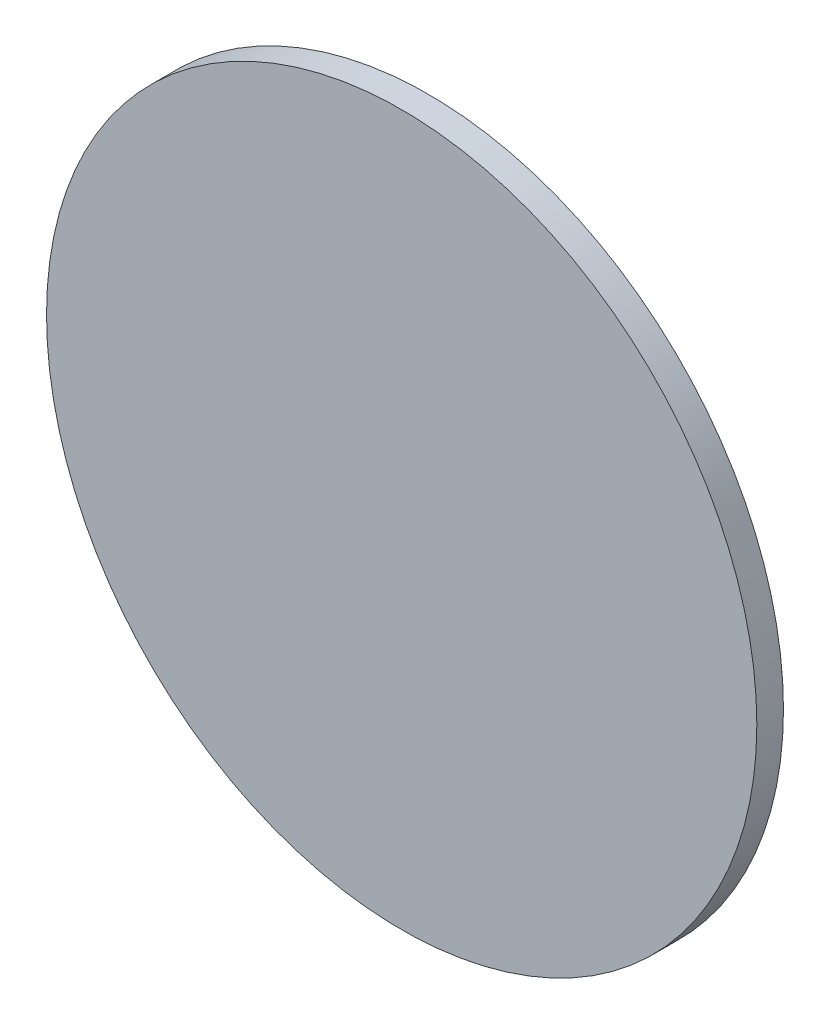
ISO-10303-21;
HEADER;
FILE_DESCRIPTION(('STEP AP214'),'2;1');
FILE_NAME('part.step','',(''),(''),'','','');
FILE_SCHEMA(('AUTOMOTIVE_DESIGN { 1 0 10303 214 1 1 1 1 }'));
ENDSEC;
DATA;
#1=APPLICATION_CONTEXT('core data for automotive mechanical design processes');
#2=APPLICATION_PROTOCOL_DEFINITION('international standard','automotive_design',2000,#1);
#3=PRODUCT_CONTEXT('',#1,'mechanical');
#4=PRODUCT('Part','Part','',(#3));
#5=PRODUCT_RELATED_PRODUCT_CATEGORY('part','',(#4));
#6=PRODUCT_DEFINITION_FORMATION('','',#4);
#7=PRODUCT_DEFINITION_CONTEXT('part definition',#1,'design');
#8=PRODUCT_DEFINITION('design','',#6,#7);
#9=PRODUCT_DEFINITION_SHAPE('','',#8);
#10=(LENGTH_UNIT() NAMED_UNIT(*) SI_UNIT(.MILLI.,.METRE.));
#11=(NAMED_UNIT(*) PLANE_ANGLE_UNIT() SI_UNIT($,.RADIAN.));
#12=(NAMED_UNIT(*) SI_UNIT($,.STERADIAN.) SOLID_ANGLE_UNIT());
#13=UNCERTAINTY_MEASURE_WITH_UNIT(LENGTH_MEASURE(1.E-05),#10,'distance_accuracy_value','');
#14=(GEOMETRIC_REPRESENTATION_CONTEXT(3) GLOBAL_UNCERTAINTY_ASSIGNED_CONTEXT((#13)) GLOBAL_UNIT_ASSIGNED_CONTEXT((#10,
#11,#12)) REPRESENTATION_CONTEXT('',''));
#15=CARTESIAN_POINT('',(0.,0.,0.));
#16=DIRECTION('',(0.,0.,1.));
#17=DIRECTION('',(1.,0.,0.));
#18=AXIS2_PLACEMENT_3D('',#15,#16,#17);
#19=CARTESIAN_POINT('',(0.,0.,3.81));
#20=DIRECTION('',(0.,0.,-1.));
#21=DIRECTION('',(-1.,0.,0.));
#22=AXIS2_PLACEMENT_3D('',#19,#20,#21);
#23=CYLINDRICAL_SURFACE('',#22,50.8);
#24=CARTESIAN_POINT('',(0.,0.,3.81));
#25=DIRECTION('',(0.,0.,1.));
#26=DIRECTION('',(1.,0.,0.));
#27=AXIS2_PLACEMENT_3D('',#24,#25,#26);
#28=CIRCLE('',#27,50.8);
#29=CARTESIAN_POINT('',(-50.8,0.,3.81));
#30=VERTEX_POINT('',#29);
#31=EDGE_CURVE('E10',#30,#30,#28,.T.);
#32=CARTESIAN_POINT('',(0.,0.,0.));
#33=DIRECTION('',(0.,0.,1.));
#34=DIRECTION('',(1.,0.,0.));
#35=AXIS2_PLACEMENT_3D('',#32,#33,#34);
#36=CIRCLE('',#35,50.8);
#37=CARTESIAN_POINT('',(-50.8,0.,0.));
#38=VERTEX_POINT('',#37);
#39=EDGE_CURVE('E36',#38,#38,#36,.T.);
#40=CARTESIAN_POINT('',(-50.8,0.,3.81));
#41=CARTESIAN_POINT('',(-50.8,0.,3.7703125));
#42=CARTESIAN_POINT('',(-50.8,0.,3.730625));
#43=CARTESIAN_POINT('',(-50.8,0.,3.65125));
#44=CARTESIAN_POINT('',(-50.8,0.,3.6115625));
#45=CARTESIAN_POINT('',(-50.8,0.,3.5321875));
#46=CARTESIAN_POINT('',(-50.8,0.,3.4925));
#47=CARTESIAN_POINT('',(-50.8,0.,3.413125));
#48=CARTESIAN_POINT('',(-50.8,0.,3.3734375));
#49=CARTESIAN_POINT('',(-50.8,0.,3.2940625));
#50=CARTESIAN_POINT('',(-50.8,0.,3.254375));
#51=CARTESIAN_POINT('',(-50.8,0.,3.175));
#52=CARTESIAN_POINT('',(-50.8,0.,3.1353125));
#53=CARTESIAN_POINT('',(-50.8,0.,3.0559375));
#54=CARTESIAN_POINT('',(-50.8,0.,3.01625));
#55=CARTESIAN_POINT('',(-50.8,0.,2.936875));
#56=CARTESIAN_POINT('',(-50.8,0.,2.8971875));
#57=CARTESIAN_POINT('',(-50.8,0.,2.8178125));
#58=CARTESIAN_POINT('',(-50.8,0.,2.778125));
#59=CARTESIAN_POINT('',(-50.8,0.,2.69875));
#60=CARTESIAN_POINT('',(-50.8,0.,2.6590625));
#61=CARTESIAN_POINT('',(-50.8,0.,2.5796875));
#62=CARTESIAN_POINT('',(-50.8,0.,2.54));
#63=CARTESIAN_POINT('',(-50.8,0.,2.460625));
#64=CARTESIAN_POINT('',(-50.8,0.,2.4209375));
#65=CARTESIAN_POINT('',(-50.8,0.,2.3415625));
#66=CARTESIAN_POINT('',(-50.8,0.,2.301875));
#67=CARTESIAN_POINT('',(-50.8,0.,2.2225));
#68=CARTESIAN_POINT('',(-50.8,0.,2.1828125));
#69=CARTESIAN_POINT('',(-50.8,0.,2.1034375));
#70=CARTESIAN_POINT('',(-50.8,0.,2.06375));
#71=CARTESIAN_POINT('',(-50.8,0.,1.984375));
#72=CARTESIAN_POINT('',(-50.8,0.,1.9446875));
#73=CARTESIAN_POINT('',(-50.8,0.,1.8653125));
#74=CARTESIAN_POINT('',(-50.8,0.,1.825625));
#75=CARTESIAN_POINT('',(-50.8,0.,1.74625));
#76=CARTESIAN_POINT('',(-50.8,0.,1.7065625));
#77=CARTESIAN_POINT('',(-50.8,0.,1.6271875));
#78=CARTESIAN_POINT('',(-50.8,0.,1.5875));
#79=CARTESIAN_POINT('',(-50.8,0.,1.508125));
#80=CARTESIAN_POINT('',(-50.8,0.,1.4684375));
#81=CARTESIAN_POINT('',(-50.8,0.,1.3890625));
#82=CARTESIAN_POINT('',(-50.8,0.,1.349375));
#83=CARTESIAN_POINT('',(-50.8,0.,1.27));
#84=CARTESIAN_POINT('',(-50.8,0.,1.2303125));
#85=CARTESIAN_POINT('',(-50.8,0.,1.1509375));
#86=CARTESIAN_POINT('',(-50.8,0.,1.11125));
#87=CARTESIAN_POINT('',(-50.8,0.,1.031875));
#88=CARTESIAN_POINT('',(-50.8,0.,0.9921875));
#89=CARTESIAN_POINT('',(-50.8,0.,0.9128125));
#90=CARTESIAN_POINT('',(-50.8,0.,0.873125));
#91=CARTESIAN_POINT('',(-50.8,0.,0.79375));
#92=CARTESIAN_POINT('',(-50.8,0.,0.7540625));
#93=CARTESIAN_POINT('',(-50.8,0.,0.6746875));
#94=CARTESIAN_POINT('',(-50.8,0.,0.635));
#95=CARTESIAN_POINT('',(-50.8,0.,0.555625));
#96=CARTESIAN_POINT('',(-50.8,0.,0.5159375));
#97=CARTESIAN_POINT('',(-50.8,0.,0.4365625));
#98=CARTESIAN_POINT('',(-50.8,0.,0.396875));
#99=CARTESIAN_POINT('',(-50.8,0.,0.3175));
#100=CARTESIAN_POINT('',(-50.8,0.,0.2778125));
#101=CARTESIAN_POINT('',(-50.8,0.,0.1984375));
#102=CARTESIAN_POINT('',(-50.8,0.,0.15875));
#103=CARTESIAN_POINT('',(-50.8,0.,0.0793749999999999));
#104=CARTESIAN_POINT('',(-50.8,0.,0.0396874999999999));
#105=CARTESIAN_POINT('',(-50.8,0.,0.));
#106=B_SPLINE_CURVE_WITH_KNOTS('',3,(#40,#41,#42,#43,#44,#45,#46,#47,#48,#49,#50,#51,#52,#53,
#54,#55,#56,#57,#58,#59,#60,#61,#62,#63,#64,#65,#66,#67,#68,#69,#70,#71,#72,#73,#74,#75,#76,#77,
#78,#79,#80,#81,#82,#83,#84,#85,#86,#87,#88,#89,#90,#91,#92,#93,#94,#95,#96,#97,#98,#99,#100,
#101,#102,#103,#104,#105),.UNSPECIFIED.,.F.,.F.,(4,2,2,2,2,2,2,2,2,2,2,2,2,2,2,2,2,2,2,2,2,2,2,
2,2,2,2,2,2,2,2,2,4),(0.,0.1190625,0.238125,0.3571875,0.47625,0.5953125,0.714375,0.8334375,
0.9525,1.0715625,1.190625,1.3096875,1.42875,1.5478125,1.666875,1.7859375,1.905,2.0240625,
2.143125,2.2621875,2.38125,2.5003125,2.619375,2.7384375,2.8575,2.9765625,3.095625,3.2146875,
3.33375,3.4528125,3.571875,3.6909375,3.81),.UNSPECIFIED.);
#107=EDGE_CURVE('BSEAM33',#30,#38,#106,.T.);
#108=ORIENTED_EDGE('',*,*,#31,.F.);
#109=ORIENTED_EDGE('',*,*,#39,.T.);
#110=ORIENTED_EDGE('',*,*,#107,.T.);
#111=ORIENTED_EDGE('',*,*,#107,.F.);
#112=EDGE_LOOP('',(#108,#110,#109,#111));
#113=FACE_BOUND('',#112,.T.);
#114=ADVANCED_FACE('F33',(#113),#23,.T.);
#115=CARTESIAN_POINT('',(0.,0.,3.81));
#116=DIRECTION('',(0.,0.,1.));
#117=DIRECTION('',(1.,0.,0.));
#118=AXIS2_PLACEMENT_3D('',#115,#116,#117);
#119=PLANE('',#118);
#120=ORIENTED_EDGE('',*,*,#31,.T.);
#121=EDGE_LOOP('',(#120));
#122=FACE_BOUND('',#121,.T.);
#123=ADVANCED_FACE('F48',(#122),#119,.T.);
#124=CARTESIAN_POINT('',(0.,0.,0.));
#125=DIRECTION('',(0.,0.,1.));
#126=DIRECTION('',(1.,0.,0.));
#127=AXIS2_PLACEMENT_3D('',#124,#125,#126);
#128=PLANE('',#127);
#129=ORIENTED_EDGE('',*,*,#39,.F.);
#130=EDGE_LOOP('',(#129));
#131=FACE_BOUND('',#130,.T.);
#132=ADVANCED_FACE('F46',(#131),#128,.F.);
#133=CLOSED_SHELL('',(#114,#123,#132));
#134=MANIFOLD_SOLID_BREP('B2',#133);
#135=ADVANCED_BREP_SHAPE_REPRESENTATION('',(#18,#134),#14);
#136=SHAPE_DEFINITION_REPRESENTATION(#9,#135);
ENDSEC;
END-ISO-10303-21;
